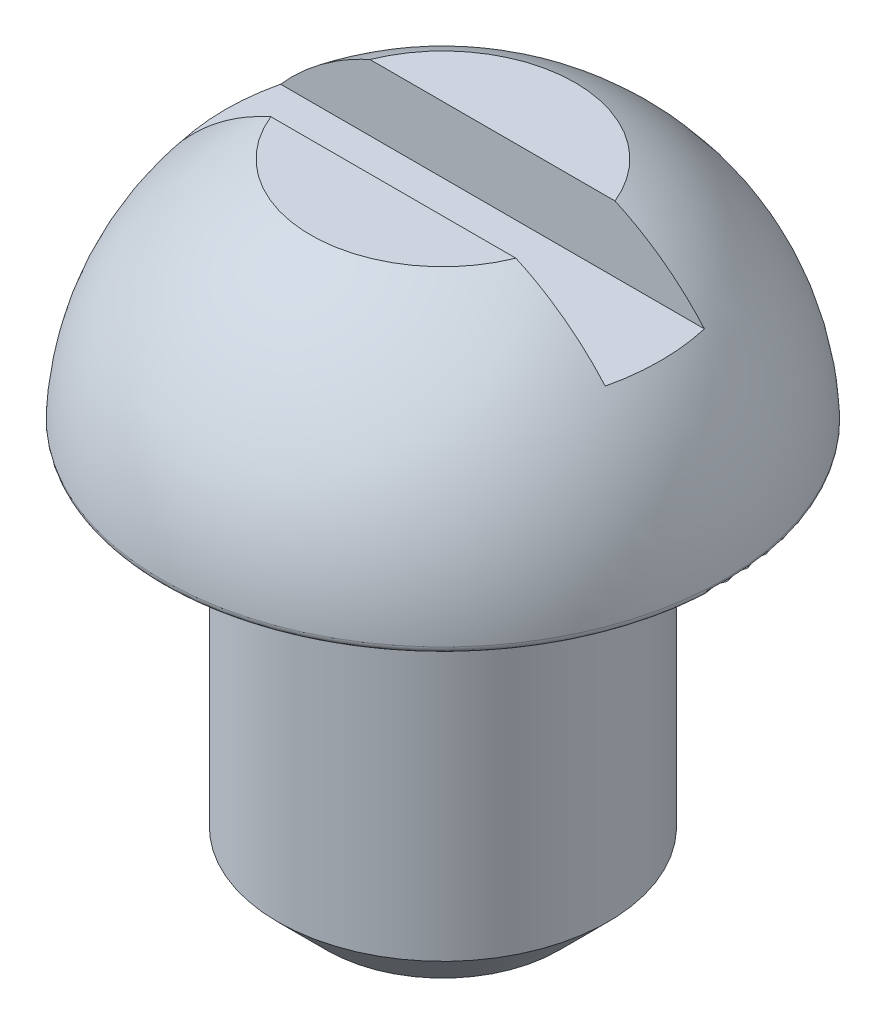
ISO-10303-21;
HEADER;
FILE_DESCRIPTION(('STEP AP214'),'2;1');
FILE_NAME('part.step','',(''),(''),'','','');
FILE_SCHEMA(('AUTOMOTIVE_DESIGN { 1 0 10303 214 1 1 1 1 }'));
ENDSEC;
DATA;
#1=APPLICATION_CONTEXT('core data for automotive mechanical design processes');
#2=APPLICATION_PROTOCOL_DEFINITION('international standard','automotive_design',2000,#1);
#3=PRODUCT_CONTEXT('',#1,'mechanical');
#4=PRODUCT('Part','Part','',(#3));
#5=PRODUCT_RELATED_PRODUCT_CATEGORY('part','',(#4));
#6=PRODUCT_DEFINITION_FORMATION('','',#4);
#7=PRODUCT_DEFINITION_CONTEXT('part definition',#1,'design');
#8=PRODUCT_DEFINITION('design','',#6,#7);
#9=PRODUCT_DEFINITION_SHAPE('','',#8);
#10=(LENGTH_UNIT() NAMED_UNIT(*) SI_UNIT(.MILLI.,.METRE.));
#11=(NAMED_UNIT(*) PLANE_ANGLE_UNIT() SI_UNIT($,.RADIAN.));
#12=(NAMED_UNIT(*) SI_UNIT($,.STERADIAN.) SOLID_ANGLE_UNIT());
#13=UNCERTAINTY_MEASURE_WITH_UNIT(LENGTH_MEASURE(1.E-05),#10,'distance_accuracy_value','');
#14=(GEOMETRIC_REPRESENTATION_CONTEXT(3) GLOBAL_UNCERTAINTY_ASSIGNED_CONTEXT((#13)) GLOBAL_UNIT_ASSIGNED_CONTEXT((#10,
#11,#12)) REPRESENTATION_CONTEXT('',''));
#15=CARTESIAN_POINT('',(0.,0.,0.));
#16=DIRECTION('',(0.,0.,1.));
#17=DIRECTION('',(1.,0.,0.));
#18=AXIS2_PLACEMENT_3D('',#15,#16,#17);
#19=CARTESIAN_POINT('',(0.,9.5,0.));
#20=DIRECTION('',(0.,1.,0.));
#21=DIRECTION('',(0.,0.,1.));
#22=AXIS2_PLACEMENT_3D('',#19,#20,#21);
#23=PLANE('',#22);
#24=DIRECTION('',(-1.,0.,0.));
#25=VECTOR('',#24,1.);
#26=CARTESIAN_POINT('',(-4.,9.5,-0.75));
#27=LINE('',#26,#25);
#28=CARTESIAN_POINT('',(1.85404962177391,9.5,-0.75));
#29=VERTEX_POINT('',#28);
#30=CARTESIAN_POINT('',(-1.85404962177391,9.5,-0.75));
#31=VERTEX_POINT('',#30);
#32=EDGE_CURVE('E85',#29,#31,#27,.T.);
#33=ORIENTED_EDGE('',*,*,#32,.F.);
#34=CARTESIAN_POINT('',(0.,9.5,0.));
#35=DIRECTION('',(0.,-1.,0.));
#36=DIRECTION('',(0.,0.,-1.));
#37=AXIS2_PLACEMENT_3D('',#34,#35,#36);
#38=CIRCLE('',#37,2.);
#39=EDGE_CURVE('E92',#31,#29,#38,.T.);
#40=ORIENTED_EDGE('',*,*,#39,.F.);
#41=EDGE_LOOP('',(#33,#40));
#42=FACE_BOUND('',#41,.T.);
#43=ADVANCED_FACE('F31',(#42),#23,.T.);
#44=CARTESIAN_POINT('',(1.75,0.,0.));
#45=DIRECTION('',(0.,-1.,0.));
#46=DIRECTION('',(0.,0.,-1.));
#47=AXIS2_PLACEMENT_3D('',#44,#45,#46);
#48=PLANE('',#47);
#49=CARTESIAN_POINT('',(0.,0.,0.));
#50=DIRECTION('',(0.,-1.,0.));
#51=DIRECTION('',(0.,0.,-1.));
#52=AXIS2_PLACEMENT_3D('',#49,#50,#51);
#53=CIRCLE('',#52,1.75);
#54=CARTESIAN_POINT('',(0.,0.,-1.75));
#55=VERTEX_POINT('',#54);
#56=EDGE_CURVE('E190',#55,#55,#53,.T.);
#57=ORIENTED_EDGE('',*,*,#56,.T.);
#58=EDGE_LOOP('',(#57));
#59=FACE_BOUND('',#58,.T.);
#60=ADVANCED_FACE('F33',(#59),#48,.T.);
#61=DIRECTION('',(1.,0.,0.));
#62=VECTOR('',#61,1.);
#63=CARTESIAN_POINT('',(-4.,9.5,0.750000000000001));
#64=LINE('',#63,#62);
#65=CARTESIAN_POINT('',(-1.85404962177391,9.5,0.75));
#66=VERTEX_POINT('',#65);
#67=CARTESIAN_POINT('',(1.85404962177391,9.5,0.75));
#68=VERTEX_POINT('',#67);
#69=EDGE_CURVE('E76',#66,#68,#64,.T.);
#70=ORIENTED_EDGE('',*,*,#69,.F.);
#71=EDGE_CURVE('E84',#68,#66,#38,.T.);
#72=ORIENTED_EDGE('',*,*,#71,.F.);
#73=EDGE_LOOP('',(#70,#72));
#74=FACE_BOUND('',#73,.T.);
#75=ADVANCED_FACE('F83',(#74),#23,.T.);
#76=CARTESIAN_POINT('',(0.,5.90254895572012,0.));
#77=DIRECTION('',(0.,-1.,0.));
#78=DIRECTION('',(0.,0.,-1.));
#79=AXIS2_PLACEMENT_3D('',#76,#77,#78);
#80=DEGENERATE_TOROIDAL_SURFACE('',#79,0.251187264453515,4.,.T.);
#81=CARTESIAN_POINT('',(0.,9.87132532317352,-0.75));
#82=CARTESIAN_POINT('',(-0.0629220390886012,9.87132542133785,-0.75));
#83=CARTESIAN_POINT('',(-0.125844467781649,9.8703374468603,-0.75));
#84=CARTESIAN_POINT('',(-0.251619483946908,9.86629565788091,-0.75));
#85=CARTESIAN_POINT('',(-0.31447207216098,9.86324186553688,-0.75));
#86=CARTESIAN_POINT('',(-0.502918858461382,9.85063878916461,-0.75));
#87=CARTESIAN_POINT('',(-0.628314596643319,9.83764727346261,-0.75));
#88=CARTESIAN_POINT('',(-0.869884431273301,9.80219279338329,-0.75));
#89=CARTESIAN_POINT('',(-0.986150684308809,9.78036270045852,-0.75));
#90=CARTESIAN_POINT('',(-1.21645990898877,9.72691962450785,-0.75));
#91=CARTESIAN_POINT('',(-1.33050229164678,9.69530408625566,-0.75));
#92=CARTESIAN_POINT('',(-1.55547287393435,9.62223207049121,-0.75));
#93=CARTESIAN_POINT('',(-1.6663990913075,9.58076948079471,-0.75));
#94=CARTESIAN_POINT('',(-1.88419647938333,9.4881868164881,-0.75));
#95=CARTESIAN_POINT('',(-1.99106618245551,9.43706328583732,-0.75));
#96=CARTESIAN_POINT('',(-2.19763665776107,9.3266772445949,-0.75));
#97=CARTESIAN_POINT('',(-2.29744086526932,9.26760826433843,-0.75));
#98=CARTESIAN_POINT('',(-2.49153541034022,9.14093982530449,-0.75));
#99=CARTESIAN_POINT('',(-2.58582359240153,9.07333706393236,-0.75));
#100=CARTESIAN_POINT('',(-2.7680690910925,8.93014039020946,-0.75));
#101=CARTESIAN_POINT('',(-2.85602908815232,8.85454989512028,-0.75));
#102=CARTESIAN_POINT('',(-3.02498268485799,8.695931842077,-0.75));
#103=CARTESIAN_POINT('',(-3.10597371602768,8.61290156494293,-0.75));
#104=CARTESIAN_POINT('',(-3.33143210845437,8.36036141406141,-0.75));
#105=CARTESIAN_POINT('',(-3.46574464429,8.18156887418059,-0.75));
#106=CARTESIAN_POINT('',(-3.70218252479334,7.80400901398985,-0.75));
#107=CARTESIAN_POINT('',(-3.80431386039929,7.60524542064207,-0.75));
#108=CARTESIAN_POINT('',(-3.97319355372104,7.19425572314944,-0.75));
#109=CARTESIAN_POINT('',(-4.0401021375461,6.98209558616589,-0.75));
#110=CARTESIAN_POINT('',(-4.13730574145651,6.54954424330069,-0.75));
#111=CARTESIAN_POINT('',(-4.16759935711677,6.32915272202548,-0.75));
#112=CARTESIAN_POINT('',(-4.19069515207767,5.88665882197309,-0.75));
#113=CARTESIAN_POINT('',(-4.18353898974582,5.66455861850789,-0.75));
#114=CARTESIAN_POINT('',(-4.13203662682793,5.22471647603451,-0.75));
#115=CARTESIAN_POINT('',(-4.08769068622574,5.00697450656997,-0.75));
#116=CARTESIAN_POINT('',(-3.96307377974643,4.58204274703518,-0.75));
#117=CARTESIAN_POINT('',(-3.88280649605122,4.37485187782938,-0.75));
#118=CARTESIAN_POINT('',(-3.68867736949314,3.97690766882909,-0.75));
#119=CARTESIAN_POINT('',(-3.57481747195614,3.78615337802955,-0.75));
#120=CARTESIAN_POINT('',(-3.31657081872274,3.42627346359333,-0.75));
#121=CARTESIAN_POINT('',(-3.17216904612608,3.25715854554567,-0.75));
#122=CARTESIAN_POINT('',(-2.93601924886324,3.02351332143022,-0.75));
#123=CARTESIAN_POINT('',(-2.85398221458268,2.94892545603554,-0.75));
#124=CARTESIAN_POINT('',(-2.68394810384282,2.80690184949098,-0.75));
#125=CARTESIAN_POINT('',(-2.59595319203264,2.73946353333475,-0.75));
#126=CARTESIAN_POINT('',(-2.41433368923245,2.61199276166022,-0.75));
#127=CARTESIAN_POINT('',(-2.32069166082742,2.55198519673803,-0.75));
#128=CARTESIAN_POINT('',(-2.12874390081305,2.44004320274453,-0.75));
#129=CARTESIAN_POINT('',(-2.0304398290893,2.38810592805728,-0.75));
#130=CARTESIAN_POINT('',(-1.82995802317233,2.2926537500461,-0.75));
#131=CARTESIAN_POINT('',(-1.72778462116708,2.24912974206796,-0.75));
#132=CARTESIAN_POINT('',(-1.52023329889945,2.17066887724191,-0.75));
#133=CARTESIAN_POINT('',(-1.41485641920221,2.13572926477363,-0.75));
#134=CARTESIAN_POINT('',(-1.2005465350259,2.0741975045066,-0.75));
#135=CARTESIAN_POINT('',(-1.09158838507219,2.04769309162907,-0.75));
#136=CARTESIAN_POINT('',(-0.871943248689848,2.00338521032545,-0.75));
#137=CARTESIAN_POINT('',(-0.761256445375318,1.98558082668133,-0.75));
#138=CARTESIAN_POINT('',(-0.538546587546816,1.95806859383276,-0.75));
#139=CARTESIAN_POINT('',(-0.426520440227821,1.94838619402209,-0.75));
#140=CARTESIAN_POINT('',(-0.25819415855627,1.93914793915042,-0.75));
#141=CARTESIAN_POINT('',(-0.202019189981139,1.93694955766882,-0.75));
#142=CARTESIAN_POINT('',(-0.0896292807192937,1.9341765918778,-0.75));
#143=CARTESIAN_POINT('',(-0.0334143413581199,1.93360195602258,-0.75));
#144=CARTESIAN_POINT('',(0.089570338134733,1.93407056708453,-0.75));
#145=CARTESIAN_POINT('',(0.156339023293252,1.9354380251739,-0.75));
#146=CARTESIAN_POINT('',(0.289786823027113,1.94053883249711,-0.75));
#147=CARTESIAN_POINT('',(0.356465939241013,1.94427213784326,-0.75));
#148=CARTESIAN_POINT('',(0.489601645075186,1.95436469770027,-0.75));
#149=CARTESIAN_POINT('',(0.556058317748405,1.96072282720604,-0.75));
#150=CARTESIAN_POINT('',(0.688634384673023,1.97628855319762,-0.75));
#151=CARTESIAN_POINT('',(0.75475377690465,1.98549616672698,-0.75));
#152=CARTESIAN_POINT('',(0.951981100661978,2.01757626217259,-0.75));
#153=CARTESIAN_POINT('',(1.08239697789367,2.04493679870434,-0.75));
#154=CARTESIAN_POINT('',(1.33999759950548,2.1121309712283,-0.75));
#155=CARTESIAN_POINT('',(1.46718176548068,2.15196682326141,-0.75));
#156=CARTESIAN_POINT('',(1.71387869519374,2.24285666478502,-0.75));
#157=CARTESIAN_POINT('',(1.83350374454184,2.29360539741072,-0.75));
#158=CARTESIAN_POINT('',(2.06724369377024,2.40650478041841,-0.75));
#159=CARTESIAN_POINT('',(2.18135873591226,2.46865513622527,-0.75));
#160=CARTESIAN_POINT('',(2.40313784057959,2.60394177082253,-0.75));
#161=CARTESIAN_POINT('',(2.51079154052084,2.67709507024298,-0.75));
#162=CARTESIAN_POINT('',(2.71834946723273,2.83359515066767,-0.75));
#163=CARTESIAN_POINT('',(2.81825469564505,2.91694061053436,-0.75));
#164=CARTESIAN_POINT('',(3.07844234976517,3.15678181482871,-0.75));
#165=CARTESIAN_POINT('',(3.23025767468538,3.32265641437973,-0.75));
#166=CARTESIAN_POINT('',(3.50336019463279,3.67750241905313,-0.75));
#167=CARTESIAN_POINT('',(3.62467695528908,3.86645118969516,-0.750000000000001));
#168=CARTESIAN_POINT('',(3.83263269671526,4.26047409624548,-0.750000000000001));
#169=CARTESIAN_POINT('',(3.91956385703199,4.46539383941384,-0.750000000000001));
#170=CARTESIAN_POINT('',(4.0577395883791,4.88697054825718,-0.750000000000001));
#171=CARTESIAN_POINT('',(4.10897748310088,5.10362970158661,-0.750000000000001));
#172=CARTESIAN_POINT('',(4.17422265872735,5.54210881083407,-0.750000000000001));
#173=CARTESIAN_POINT('',(4.18829264552823,5.76391943692915,-0.750000000000001));
#174=CARTESIAN_POINT('',(4.17897916787921,6.20674832446059,-0.750000000000001));
#175=CARTESIAN_POINT('',(4.15559659045676,6.42776660453865,-0.750000000000001));
#176=CARTESIAN_POINT('',(4.07206283828415,6.86267082829224,-0.750000000000001));
#177=CARTESIAN_POINT('',(4.01192268581079,7.07655888979661,-0.750000000000001));
#178=CARTESIAN_POINT('',(3.85659607902625,7.49119914686961,-0.750000000000001));
#179=CARTESIAN_POINT('',(3.76141172880568,7.6919521302301,-0.750000000000001));
#180=CARTESIAN_POINT('',(3.53871279537206,8.07469006693469,-0.750000000000001));
#181=CARTESIAN_POINT('',(3.41118817548028,8.25666916916653,-0.75));
#182=CARTESIAN_POINT('',(3.12731814091474,8.59677215153954,-0.75));
#183=CARTESIAN_POINT('',(2.97096759896837,8.7548917786782,-0.750000000000001));
#184=CARTESIAN_POINT('',(2.71830594289221,8.97080228372003,-0.75));
#185=CARTESIAN_POINT('',(2.6309277740663,9.03930849424628,-0.75));
#186=CARTESIAN_POINT('',(2.45074238373382,9.16874513009402,-0.75));
#187=CARTESIAN_POINT('',(2.35793712481219,9.22967826943667,-0.75));
#188=CARTESIAN_POINT('',(2.1675677834584,9.34355721842799,-0.75));
#189=CARTESIAN_POINT('',(2.07000403410402,9.39650358606412,-0.75));
#190=CARTESIAN_POINT('',(1.87084215744287,9.49407538951569,-0.75));
#191=CARTESIAN_POINT('',(1.76924542615833,9.53870367470134,-0.75));
#192=CARTESIAN_POINT('',(1.56195371290642,9.6197215068276,-0.75));
#193=CARTESIAN_POINT('',(1.45623396355732,9.65604763035052,-0.75));
#194=CARTESIAN_POINT('',(1.24221239842266,9.71991548869703,-0.75));
#195=CARTESIAN_POINT('',(1.13391134592797,9.74745978650354,-0.75));
#196=CARTESIAN_POINT('',(0.915531306850145,9.79386416580157,-0.75));
#197=CARTESIAN_POINT('',(0.805453199909165,9.81272841526485,-0.75));
#198=CARTESIAN_POINT('',(0.584239227879707,9.84226726636226,-0.75));
#199=CARTESIAN_POINT('',(0.47310355933594,9.85294336076815,-0.75));
#200=CARTESIAN_POINT('',(0.301534200611884,9.86390210131914,-0.75));
#201=CARTESIAN_POINT('',(0.241243654966935,9.86670610358041,-0.75));
#202=CARTESIAN_POINT('',(0.12063550406229,9.87041715520305,-0.75));
#203=CARTESIAN_POINT('',(0.0603179310427579,9.87132522907184,-0.75));
#204=CARTESIAN_POINT('',(0.,9.87132532317352,-0.75));
#205=B_SPLINE_CURVE_WITH_KNOTS('',3,(#81,#82,#83,#84,#85,#86,#87,#88,#89,#90,#91,#92,#93,#94,
#95,#96,#97,#98,#99,#100,#101,#102,#103,#104,#105,#106,#107,#108,#109,#110,#111,#112,#113,#114,
#115,#116,#117,#118,#119,#120,#121,#122,#123,#124,#125,#126,#127,#128,#129,#130,#131,#132,#133,
#134,#135,#136,#137,#138,#139,#140,#141,#142,#143,#144,#145,#146,#147,#148,#149,#150,#151,#152,
#153,#154,#155,#156,#157,#158,#159,#160,#161,#162,#163,#164,#165,#166,#167,#168,#169,#170,#171,
#172,#173,#174,#175,#176,#177,#178,#179,#180,#181,#182,#183,#184,#185,#186,#187,#188,#189,#190,
#191,#192,#193,#194,#195,#196,#197,#198,#199,#200,#201,#202,#203,#204),.UNSPECIFIED.,.T.,.F.,(4,
2,2,2,2,2,2,2,2,2,2,2,2,2,2,2,2,2,2,2,2,2,2,2,2,2,2,2,2,2,2,2,2,2,2,2,2,2,2,2,2,2,2,2,2,2,2,2,2,
2,2,2,2,2,2,2,2,2,2,2,2,4),(0.,0.188756294687436,0.377510564821113,0.755280997491542,
1.10977622931115,1.46436410697405,1.81917265954468,2.174108380069,2.52158816349091,
2.86920283711227,3.21666939393033,3.56426346905097,4.23165319589308,4.89891860617539,
5.56312185026573,6.2273505701151,6.89084057267821,7.5543259369976,8.21774330512855,
8.88112226273996,9.54482815347266,9.87713428134949,10.20932031517,10.5425905787883,
10.875743062033,11.2085329713489,11.541215913981,11.8772538585757,12.2132564453317,
12.550307969775,12.7189437464545,12.8875741697316,13.0878831385615,13.2881883916656,
13.488407882506,13.688628570937,14.0877550451071,14.4869524579857,14.876172775606,
15.2653830386506,15.6552016901302,16.0449698656331,16.7160597555839,17.3864965532814,
18.051107440301,18.7158426072585,19.3794555826048,20.0430528411576,20.7064512082832,
21.3698097507647,22.0333744165032,22.6970572246923,23.0298308802171,23.3624849310183,
23.6951157305166,24.0276323766348,24.3626101283002,24.6974900267561,25.0322089548769,
25.3668668463163,25.5479090789648,25.7288534560345),.UNSPECIFIED.);
#206=CARTESIAN_POINT('',(-3.20655950030948,8.5,-0.75));
#207=VERTEX_POINT('',#206);
#208=EDGE_CURVE('E11',#31,#207,#205,.T.);
#209=ORIENTED_EDGE('',*,*,#208,.F.);
#210=ORIENTED_EDGE('',*,*,#39,.T.);
#211=CARTESIAN_POINT('',(3.20655950030948,8.5,-0.75));
#212=VERTEX_POINT('',#211);
#213=EDGE_CURVE('E35',#212,#29,#205,.T.);
#214=ORIENTED_EDGE('',*,*,#213,.F.);
#215=CARTESIAN_POINT('',(0.,8.5,0.));
#216=DIRECTION('',(0.,1.,0.));
#217=DIRECTION('',(0.,0.,1.));
#218=AXIS2_PLACEMENT_3D('',#215,#216,#217);
#219=CIRCLE('',#218,3.29310246257613);
#220=CARTESIAN_POINT('',(3.20655950030948,8.5,0.75));
#221=VERTEX_POINT('',#220);
#222=EDGE_CURVE('E104',#212,#221,#219,.F.);
#223=ORIENTED_EDGE('',*,*,#222,.T.);
#224=CARTESIAN_POINT('',(0.,9.87132532317352,0.75));
#225=CARTESIAN_POINT('',(0.0629220390886012,9.87132542133785,0.75));
#226=CARTESIAN_POINT('',(0.125844467781649,9.8703374468603,0.75));
#227=CARTESIAN_POINT('',(0.251619483946908,9.86629565788091,0.75));
#228=CARTESIAN_POINT('',(0.31447207216098,9.86324186553688,0.75));
#229=CARTESIAN_POINT('',(0.502918858461382,9.85063878916461,0.75));
#230=CARTESIAN_POINT('',(0.628314596643319,9.83764727346261,0.75));
#231=CARTESIAN_POINT('',(0.869884431273301,9.80219279338329,0.75));
#232=CARTESIAN_POINT('',(0.986150684308809,9.78036270045852,0.75));
#233=CARTESIAN_POINT('',(1.21645990898877,9.72691962450785,0.75));
#234=CARTESIAN_POINT('',(1.33050229164678,9.69530408625566,0.75));
#235=CARTESIAN_POINT('',(1.55547287393435,9.62223207049121,0.75));
#236=CARTESIAN_POINT('',(1.6663990913075,9.58076948079471,0.75));
#237=CARTESIAN_POINT('',(1.88419647938333,9.4881868164881,0.75));
#238=CARTESIAN_POINT('',(1.99106618245551,9.43706328583732,0.75));
#239=CARTESIAN_POINT('',(2.19763665776107,9.3266772445949,0.75));
#240=CARTESIAN_POINT('',(2.29744086526932,9.26760826433843,0.75));
#241=CARTESIAN_POINT('',(2.49153541034022,9.14093982530449,0.75));
#242=CARTESIAN_POINT('',(2.58582359240153,9.07333706393236,0.75));
#243=CARTESIAN_POINT('',(2.7680690910925,8.93014039020946,0.75));
#244=CARTESIAN_POINT('',(2.85602908815232,8.85454989512028,0.75));
#245=CARTESIAN_POINT('',(3.02498268485799,8.695931842077,0.75));
#246=CARTESIAN_POINT('',(3.10597371602768,8.61290156494293,0.75));
#247=CARTESIAN_POINT('',(3.33143210845437,8.36036141406141,0.75));
#248=CARTESIAN_POINT('',(3.46574464429,8.18156887418059,0.75));
#249=CARTESIAN_POINT('',(3.70218252479334,7.80400901398985,0.75));
#250=CARTESIAN_POINT('',(3.80431386039929,7.60524542064207,0.749999999999999));
#251=CARTESIAN_POINT('',(3.97319355372104,7.19425572314944,0.749999999999999));
#252=CARTESIAN_POINT('',(4.0401021375461,6.98209558616589,0.749999999999999));
#253=CARTESIAN_POINT('',(4.13730574145651,6.54954424330069,0.749999999999999));
#254=CARTESIAN_POINT('',(4.16759935711677,6.32915272202548,0.749999999999999));
#255=CARTESIAN_POINT('',(4.19069515207767,5.88665882197309,0.749999999999999));
#256=CARTESIAN_POINT('',(4.18353898974582,5.66455861850789,0.749999999999999));
#257=CARTESIAN_POINT('',(4.13203662682793,5.22471647603451,0.749999999999999));
#258=CARTESIAN_POINT('',(4.08769068622574,5.00697450656997,0.749999999999999));
#259=CARTESIAN_POINT('',(3.96307377974643,4.58204274703518,0.749999999999999));
#260=CARTESIAN_POINT('',(3.88280649605122,4.37485187782938,0.749999999999999));
#261=CARTESIAN_POINT('',(3.68867736949314,3.97690766882909,0.749999999999999));
#262=CARTESIAN_POINT('',(3.57481747195614,3.78615337802955,0.75));
#263=CARTESIAN_POINT('',(3.31657081872274,3.42627346359333,0.75));
#264=CARTESIAN_POINT('',(3.17216904612608,3.25715854554567,0.749999999999999));
#265=CARTESIAN_POINT('',(2.93601924886324,3.02351332143022,0.75));
#266=CARTESIAN_POINT('',(2.85398221458268,2.94892545603554,0.75));
#267=CARTESIAN_POINT('',(2.68394810384282,2.80690184949098,0.75));
#268=CARTESIAN_POINT('',(2.59595319203264,2.73946353333475,0.75));
#269=CARTESIAN_POINT('',(2.41433368923245,2.61199276166022,0.75));
#270=CARTESIAN_POINT('',(2.32069166082742,2.55198519673803,0.75));
#271=CARTESIAN_POINT('',(2.12874390081305,2.44004320274453,0.75));
#272=CARTESIAN_POINT('',(2.0304398290893,2.38810592805728,0.75));
#273=CARTESIAN_POINT('',(1.82995802317233,2.2926537500461,0.75));
#274=CARTESIAN_POINT('',(1.72778462116708,2.24912974206796,0.75));
#275=CARTESIAN_POINT('',(1.52023329889945,2.17066887724191,0.75));
#276=CARTESIAN_POINT('',(1.41485641920221,2.13572926477363,0.75));
#277=CARTESIAN_POINT('',(1.2005465350259,2.0741975045066,0.75));
#278=CARTESIAN_POINT('',(1.09158838507218,2.04769309162907,0.75));
#279=CARTESIAN_POINT('',(0.871943248689846,2.00338521032545,0.75));
#280=CARTESIAN_POINT('',(0.761256445375317,1.98558082668133,0.75));
#281=CARTESIAN_POINT('',(0.538546587546815,1.95806859383276,0.75));
#282=CARTESIAN_POINT('',(0.426520440227819,1.94838619402209,0.75));
#283=CARTESIAN_POINT('',(0.25819415855627,1.93914793915042,0.75));
#284=CARTESIAN_POINT('',(0.202019189981139,1.93694955766882,0.75));
#285=CARTESIAN_POINT('',(0.089629280719294,1.9341765918778,0.75));
#286=CARTESIAN_POINT('',(0.0334143413581202,1.93360195602257,0.75));
#287=CARTESIAN_POINT('',(-0.0895703381347327,1.93407056708453,0.75));
#288=CARTESIAN_POINT('',(-0.156339023293251,1.9354380251739,0.75));
#289=CARTESIAN_POINT('',(-0.289786823027113,1.94053883249711,0.75));
#290=CARTESIAN_POINT('',(-0.356465939241013,1.94427213784326,0.75));
#291=CARTESIAN_POINT('',(-0.489601645075185,1.95436469770027,0.75));
#292=CARTESIAN_POINT('',(-0.556058317748405,1.96072282720604,0.75));
#293=CARTESIAN_POINT('',(-0.688634384673023,1.97628855319762,0.75));
#294=CARTESIAN_POINT('',(-0.75475377690465,1.98549616672698,0.75));
#295=CARTESIAN_POINT('',(-0.951981100661977,2.01757626217259,0.75));
#296=CARTESIAN_POINT('',(-1.08239697789367,2.04493679870434,0.75));
#297=CARTESIAN_POINT('',(-1.33999759950547,2.1121309712283,0.75));
#298=CARTESIAN_POINT('',(-1.46718176548068,2.15196682326141,0.75));
#299=CARTESIAN_POINT('',(-1.71387869519374,2.24285666478502,0.75));
#300=CARTESIAN_POINT('',(-1.83350374454184,2.29360539741072,0.75));
#301=CARTESIAN_POINT('',(-2.06724369377024,2.40650478041841,0.75));
#302=CARTESIAN_POINT('',(-2.18135873591226,2.46865513622527,0.75));
#303=CARTESIAN_POINT('',(-2.40313784057959,2.60394177082253,0.75));
#304=CARTESIAN_POINT('',(-2.51079154052084,2.67709507024297,0.75));
#305=CARTESIAN_POINT('',(-2.71834946723273,2.83359515066767,0.75));
#306=CARTESIAN_POINT('',(-2.81825469564505,2.91694061053436,0.75));
#307=CARTESIAN_POINT('',(-3.07844234976517,3.15678181482871,0.75));
#308=CARTESIAN_POINT('',(-3.23025767468538,3.32265641437973,0.75));
#309=CARTESIAN_POINT('',(-3.50336019463279,3.67750241905313,0.75));
#310=CARTESIAN_POINT('',(-3.62467695528908,3.86645118969516,0.750000000000001));
#311=CARTESIAN_POINT('',(-3.83263269671526,4.26047409624548,0.750000000000001));
#312=CARTESIAN_POINT('',(-3.91956385703199,4.46539383941384,0.750000000000001));
#313=CARTESIAN_POINT('',(-4.0577395883791,4.88697054825718,0.750000000000001));
#314=CARTESIAN_POINT('',(-4.10897748310088,5.10362970158661,0.750000000000001));
#315=CARTESIAN_POINT('',(-4.17422265872735,5.54210881083407,0.750000000000001));
#316=CARTESIAN_POINT('',(-4.18829264552823,5.76391943692915,0.750000000000001));
#317=CARTESIAN_POINT('',(-4.17897916787921,6.20674832446059,0.750000000000001));
#318=CARTESIAN_POINT('',(-4.15559659045676,6.42776660453865,0.750000000000001));
#319=CARTESIAN_POINT('',(-4.07206283828415,6.86267082829224,0.750000000000001));
#320=CARTESIAN_POINT('',(-4.01192268581079,7.07655888979661,0.750000000000001));
#321=CARTESIAN_POINT('',(-3.85659607902625,7.49119914686961,0.750000000000001));
#322=CARTESIAN_POINT('',(-3.76141172880568,7.6919521302301,0.750000000000001));
#323=CARTESIAN_POINT('',(-3.53871279537206,8.07469006693469,0.750000000000001));
#324=CARTESIAN_POINT('',(-3.41118817548028,8.25666916916653,0.75));
#325=CARTESIAN_POINT('',(-3.12731814091474,8.59677215153954,0.75));
#326=CARTESIAN_POINT('',(-2.97096759896837,8.7548917786782,0.750000000000001));
#327=CARTESIAN_POINT('',(-2.71830594289221,8.97080228372003,0.75));
#328=CARTESIAN_POINT('',(-2.6309277740663,9.03930849424628,0.75));
#329=CARTESIAN_POINT('',(-2.45074238373382,9.16874513009402,0.75));
#330=CARTESIAN_POINT('',(-2.35793712481219,9.22967826943667,0.75));
#331=CARTESIAN_POINT('',(-2.1675677834584,9.34355721842799,0.75));
#332=CARTESIAN_POINT('',(-2.07000403410402,9.39650358606412,0.75));
#333=CARTESIAN_POINT('',(-1.87084215744287,9.49407538951569,0.75));
#334=CARTESIAN_POINT('',(-1.76924542615833,9.53870367470134,0.75));
#335=CARTESIAN_POINT('',(-1.56195371290642,9.6197215068276,0.75));
#336=CARTESIAN_POINT('',(-1.45623396355732,9.65604763035052,0.75));
#337=CARTESIAN_POINT('',(-1.24221239842266,9.71991548869703,0.75));
#338=CARTESIAN_POINT('',(-1.13391134592797,9.74745978650354,0.75));
#339=CARTESIAN_POINT('',(-0.915531306850145,9.79386416580157,0.75));
#340=CARTESIAN_POINT('',(-0.805453199909165,9.81272841526485,0.75));
#341=CARTESIAN_POINT('',(-0.584239227879708,9.84226726636226,0.75));
#342=CARTESIAN_POINT('',(-0.47310355933594,9.85294336076815,0.75));
#343=CARTESIAN_POINT('',(-0.301534200611884,9.86390210131914,0.75));
#344=CARTESIAN_POINT('',(-0.241243654966935,9.86670610358041,0.75));
#345=CARTESIAN_POINT('',(-0.12063550406229,9.87041715520305,0.75));
#346=CARTESIAN_POINT('',(-0.0603179310427579,9.87132522907184,0.75));
#347=CARTESIAN_POINT('',(0.,9.87132532317352,0.75));
#348=B_SPLINE_CURVE_WITH_KNOTS('',3,(#224,#225,#226,#227,#228,#229,#230,#231,#232,#233,#234,
#235,#236,#237,#238,#239,#240,#241,#242,#243,#244,#245,#246,#247,#248,#249,#250,#251,#252,#253,
#254,#255,#256,#257,#258,#259,#260,#261,#262,#263,#264,#265,#266,#267,#268,#269,#270,#271,#272,
#273,#274,#275,#276,#277,#278,#279,#280,#281,#282,#283,#284,#285,#286,#287,#288,#289,#290,#291,
#292,#293,#294,#295,#296,#297,#298,#299,#300,#301,#302,#303,#304,#305,#306,#307,#308,#309,#310,
#311,#312,#313,#314,#315,#316,#317,#318,#319,#320,#321,#322,#323,#324,#325,#326,#327,#328,#329,
#330,#331,#332,#333,#334,#335,#336,#337,#338,#339,#340,#341,#342,#343,#344,#345,#346,#347),
.UNSPECIFIED.,.T.,.F.,(4,2,2,2,2,2,2,2,2,2,2,2,2,2,2,2,2,2,2,2,2,2,2,2,2,2,2,2,2,2,2,2,2,2,2,2,
2,2,2,2,2,2,2,2,2,2,2,2,2,2,2,2,2,2,2,2,2,2,2,2,2,4),(0.,0.188756294687436,0.377510564821113,
0.755280997491542,1.10977622931115,1.46436410697405,1.81917265954468,2.174108380069,
2.52158816349091,2.86920283711227,3.21666939393033,3.56426346905097,4.23165319589308,
4.89891860617539,5.56312185026573,6.2273505701151,6.89084057267821,7.5543259369976,
8.21774330512855,8.88112226273996,9.54482815347266,9.87713428134949,10.20932031517,
10.5425905787883,10.875743062033,11.2085329713489,11.541215913981,11.8772538585757,
12.2132564453317,12.550307969775,12.7189437464545,12.8875741697316,13.0878831385615,
13.2881883916656,13.488407882506,13.688628570937,14.087755045107,14.4869524579857,
14.876172775606,15.2653830386506,15.6552016901302,16.0449698656331,16.7160597555839,
17.3864965532814,18.051107440301,18.7158426072585,19.3794555826048,20.0430528411576,
20.7064512082832,21.3698097507646,22.0333744165032,22.6970572246923,23.0298308802171,
23.3624849310183,23.6951157305166,24.0276323766348,24.3626101283001,24.6974900267561,
25.0322089548769,25.3668668463163,25.5479090789648,25.7288534560345),.UNSPECIFIED.);
#349=EDGE_CURVE('E80',#68,#221,#348,.T.);
#350=ORIENTED_EDGE('',*,*,#349,.F.);
#351=ORIENTED_EDGE('',*,*,#71,.T.);
#352=CARTESIAN_POINT('',(-3.20655950030948,8.5,0.75));
#353=VERTEX_POINT('',#352);
#354=EDGE_CURVE('E44',#353,#66,#348,.T.);
#355=ORIENTED_EDGE('',*,*,#354,.F.);
#356=EDGE_CURVE('E56',#353,#207,#219,.F.);
#357=ORIENTED_EDGE('',*,*,#356,.T.);
#358=EDGE_LOOP('',(#209,#210,#214,#223,#350,#351,#355,#357));
#359=FACE_BOUND('',#358,.T.);
#360=CARTESIAN_POINT('',(0.,6.10506284728923,0.));
#361=DIRECTION('',(0.,-1.,0.));
#362=DIRECTION('',(0.,0.,-1.));
#363=AXIS2_PLACEMENT_3D('',#360,#361,#362);
#364=CIRCLE('',#363,4.24605749059623);
#365=CARTESIAN_POINT('',(0.,6.10506284728923,-4.24605749059623));
#366=VERTEX_POINT('',#365);
#367=EDGE_CURVE('E95',#366,#366,#364,.F.);
#368=ORIENTED_EDGE('',*,*,#367,.T.);
#369=EDGE_LOOP('',(#368));
#370=FACE_BOUND('',#369,.T.);
#371=ADVANCED_FACE('F88',(#359,#370),#80,.T.);
#372=CARTESIAN_POINT('',(4.25,6.,0.));
#373=DIRECTION('',(0.,-1.,0.));
#374=DIRECTION('',(0.,0.,-1.));
#375=AXIS2_PLACEMENT_3D('',#372,#373,#374);
#376=PLANE('',#375);
#377=CARTESIAN_POINT('',(0.,6.,0.));
#378=DIRECTION('',(0.,-1.,0.));
#379=DIRECTION('',(0.,0.,-1.));
#380=AXIS2_PLACEMENT_3D('',#377,#378,#379);
#381=CIRCLE('',#380,4.14618573494266);
#382=CARTESIAN_POINT('',(0.,6.,-4.14618573494266));
#383=VERTEX_POINT('',#382);
#384=EDGE_CURVE('E91',#383,#383,#381,.T.);
#385=ORIENTED_EDGE('',*,*,#384,.T.);
#386=EDGE_LOOP('',(#385));
#387=FACE_BOUND('',#386,.T.);
#388=CARTESIAN_POINT('',(0.,6.,0.));
#389=DIRECTION('',(0.,-1.,0.));
#390=DIRECTION('',(0.,0.,-1.));
#391=AXIS2_PLACEMENT_3D('',#388,#389,#390);
#392=CIRCLE('',#391,2.5);
#393=CARTESIAN_POINT('',(0.,6.,-2.5));
#394=VERTEX_POINT('',#393);
#395=EDGE_CURVE('E98',#394,#394,#392,.T.);
#396=ORIENTED_EDGE('',*,*,#395,.F.);
#397=EDGE_LOOP('',(#396));
#398=FACE_BOUND('',#397,.T.);
#399=ADVANCED_FACE('F127',(#387,#398),#376,.T.);
#400=CARTESIAN_POINT('',(0.,0.,0.));
#401=DIRECTION('',(0.,-1.,0.));
#402=DIRECTION('',(0.,0.,-1.));
#403=AXIS2_PLACEMENT_3D('',#400,#401,#402);
#404=CYLINDRICAL_SURFACE('',#403,2.5);
#405=ORIENTED_EDGE('',*,*,#395,.T.);
#406=EDGE_LOOP('',(#405));
#407=FACE_BOUND('',#406,.T.);
#408=CARTESIAN_POINT('',(0.,0.75,0.));
#409=DIRECTION('',(0.,-1.,0.));
#410=DIRECTION('',(0.,0.,-1.));
#411=AXIS2_PLACEMENT_3D('',#408,#409,#410);
#412=CIRCLE('',#411,2.5);
#413=CARTESIAN_POINT('',(0.,0.75,-2.5));
#414=VERTEX_POINT('',#413);
#415=EDGE_CURVE('E196',#414,#414,#412,.T.);
#416=ORIENTED_EDGE('',*,*,#415,.F.);
#417=EDGE_LOOP('',(#416));
#418=FACE_BOUND('',#417,.T.);
#419=ADVANCED_FACE('F124',(#407,#418),#404,.T.);
#420=CARTESIAN_POINT('',(0.,0.,0.));
#421=DIRECTION('',(0.,1.,0.));
#422=DIRECTION('',(0.,0.,1.));
#423=AXIS2_PLACEMENT_3D('',#420,#421,#422);
#424=CONICAL_SURFACE('',#423,1.75,0.785398163397446);
#425=ORIENTED_EDGE('',*,*,#415,.T.);
#426=EDGE_LOOP('',(#425));
#427=FACE_BOUND('',#426,.T.);
#428=ORIENTED_EDGE('',*,*,#56,.F.);
#429=EDGE_LOOP('',(#428));
#430=FACE_BOUND('',#429,.T.);
#431=ADVANCED_FACE('F120',(#427,#430),#424,.T.);
#432=CARTESIAN_POINT('',(0.,6.1,0.));
#433=DIRECTION('',(0.,-1.,0.));
#434=DIRECTION('',(0.,0.,-1.));
#435=AXIS2_PLACEMENT_3D('',#432,#433,#434);
#436=TOROIDAL_SURFACE('',#435,4.14618573494266,0.1);
#437=ORIENTED_EDGE('',*,*,#367,.F.);
#438=EDGE_LOOP('',(#437));
#439=FACE_BOUND('',#438,.T.);
#440=ORIENTED_EDGE('',*,*,#384,.F.);
#441=EDGE_LOOP('',(#440));
#442=FACE_BOUND('',#441,.T.);
#443=ADVANCED_FACE('F117',(#439,#442),#436,.T.);
#444=CARTESIAN_POINT('',(-4.,8.5,-0.75));
#445=DIRECTION('',(0.,0.,-1.));
#446=DIRECTION('',(-1.,0.,0.));
#447=AXIS2_PLACEMENT_3D('',#444,#445,#446);
#448=PLANE('',#447);
#449=ORIENTED_EDGE('',*,*,#208,.T.);
#450=DIRECTION('',(-1.,0.,0.));
#451=VECTOR('',#450,1.);
#452=CARTESIAN_POINT('',(-4.,8.5,-0.75));
#453=LINE('',#452,#451);
#454=EDGE_CURVE('E187',#212,#207,#453,.T.);
#455=ORIENTED_EDGE('',*,*,#454,.F.);
#456=ORIENTED_EDGE('',*,*,#213,.T.);
#457=ORIENTED_EDGE('',*,*,#32,.T.);
#458=EDGE_LOOP('',(#449,#455,#456,#457));
#459=FACE_BOUND('',#458,.T.);
#460=ADVANCED_FACE('F114',(#459),#448,.F.);
#461=CARTESIAN_POINT('',(-4.,8.5,0.750000000000001));
#462=DIRECTION('',(0.,0.,1.));
#463=DIRECTION('',(1.,0.,0.));
#464=AXIS2_PLACEMENT_3D('',#461,#462,#463);
#465=PLANE('',#464);
#466=ORIENTED_EDGE('',*,*,#349,.T.);
#467=DIRECTION('',(1.,0.,0.));
#468=VECTOR('',#467,1.);
#469=CARTESIAN_POINT('',(-4.,8.5,0.750000000000001));
#470=LINE('',#469,#468);
#471=EDGE_CURVE('E51',#353,#221,#470,.T.);
#472=ORIENTED_EDGE('',*,*,#471,.F.);
#473=ORIENTED_EDGE('',*,*,#354,.T.);
#474=ORIENTED_EDGE('',*,*,#69,.T.);
#475=EDGE_LOOP('',(#466,#472,#473,#474));
#476=FACE_BOUND('',#475,.T.);
#477=ADVANCED_FACE('F75',(#476),#465,.F.);
#478=CARTESIAN_POINT('',(-4.,8.5,-0.75));
#479=DIRECTION('',(0.,1.,0.));
#480=DIRECTION('',(0.,0.,1.));
#481=AXIS2_PLACEMENT_3D('',#478,#479,#480);
#482=PLANE('',#481);
#483=ORIENTED_EDGE('',*,*,#471,.T.);
#484=ORIENTED_EDGE('',*,*,#222,.F.);
#485=ORIENTED_EDGE('',*,*,#454,.T.);
#486=ORIENTED_EDGE('',*,*,#356,.F.);
#487=EDGE_LOOP('',(#483,#484,#485,#486));
#488=FACE_BOUND('',#487,.T.);
#489=ADVANCED_FACE('F113',(#488),#482,.T.);
#490=CLOSED_SHELL('',(#43,#60,#75,#371,#399,#419,#431,#443,#460,#477,#489));
#491=MANIFOLD_SOLID_BREP('B2',#490);
#492=ADVANCED_BREP_SHAPE_REPRESENTATION('',(#18,#491),#14);
#493=SHAPE_DEFINITION_REPRESENTATION(#9,#492);
ENDSEC;
END-ISO-10303-21;
